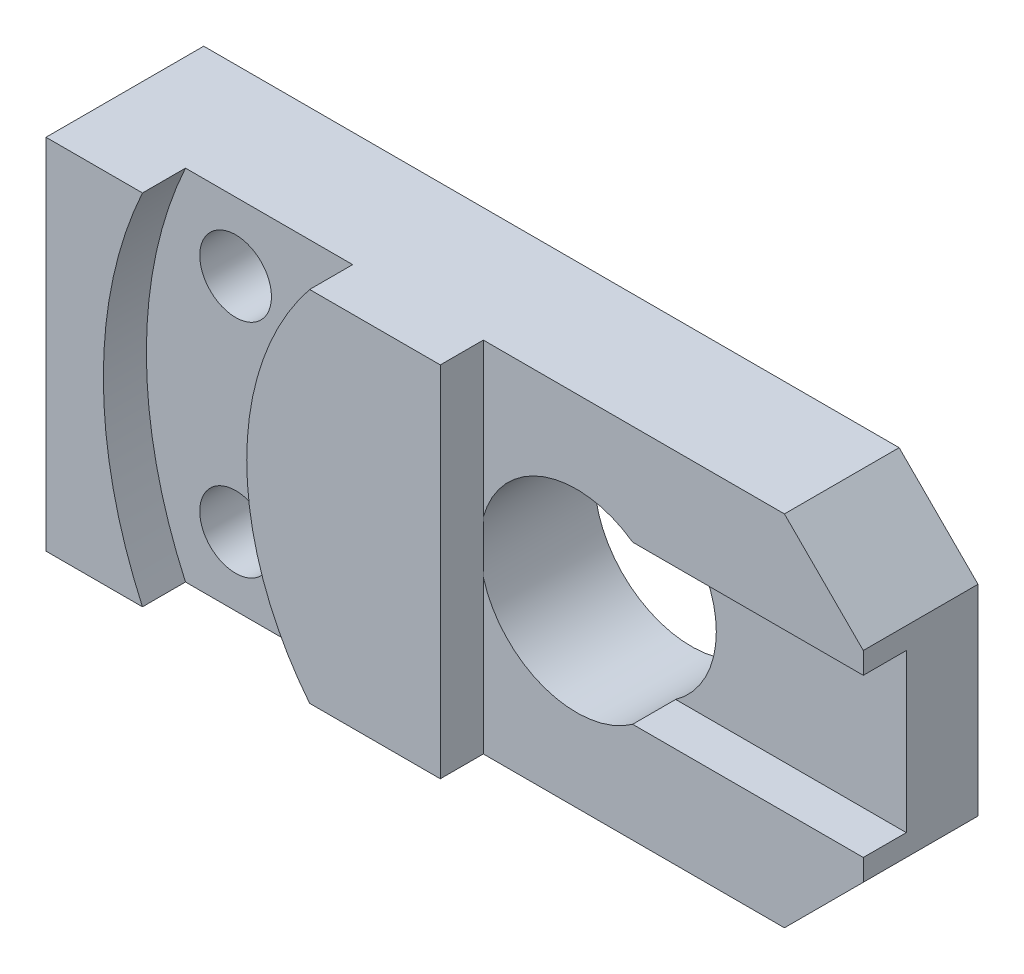
ISO-10303-21;
HEADER;
FILE_DESCRIPTION(('STEP AP214'),'2;1');
FILE_NAME('part.step','',(''),(''),'','','');
FILE_SCHEMA(('AUTOMOTIVE_DESIGN { 1 0 10303 214 1 1 1 1 }'));
ENDSEC;
DATA;
#1=APPLICATION_CONTEXT('core data for automotive mechanical design processes');
#2=APPLICATION_PROTOCOL_DEFINITION('international standard','automotive_design',2000,#1);
#3=PRODUCT_CONTEXT('',#1,'mechanical');
#4=PRODUCT('Part','Part','',(#3));
#5=PRODUCT_RELATED_PRODUCT_CATEGORY('part','',(#4));
#6=PRODUCT_DEFINITION_FORMATION('','',#4);
#7=PRODUCT_DEFINITION_CONTEXT('part definition',#1,'design');
#8=PRODUCT_DEFINITION('design','',#6,#7);
#9=PRODUCT_DEFINITION_SHAPE('','',#8);
#10=(LENGTH_UNIT() NAMED_UNIT(*) SI_UNIT(.MILLI.,.METRE.));
#11=(NAMED_UNIT(*) PLANE_ANGLE_UNIT() SI_UNIT($,.RADIAN.));
#12=(NAMED_UNIT(*) SI_UNIT($,.STERADIAN.) SOLID_ANGLE_UNIT());
#13=UNCERTAINTY_MEASURE_WITH_UNIT(LENGTH_MEASURE(1.E-05),#10,'distance_accuracy_value','');
#14=(GEOMETRIC_REPRESENTATION_CONTEXT(3) GLOBAL_UNCERTAINTY_ASSIGNED_CONTEXT((#13)) GLOBAL_UNIT_ASSIGNED_CONTEXT((#10,
#11,#12)) REPRESENTATION_CONTEXT('',''));
#15=CARTESIAN_POINT('',(0.,0.,0.));
#16=DIRECTION('',(0.,0.,1.));
#17=DIRECTION('',(1.,0.,0.));
#18=AXIS2_PLACEMENT_3D('',#15,#16,#17);
#19=CARTESIAN_POINT('',(0.,0.,16.));
#20=DIRECTION('',(0.,0.,-1.));
#21=DIRECTION('',(-1.,0.,0.));
#22=AXIS2_PLACEMENT_3D('',#19,#20,#21);
#23=PLANE('',#22);
#24=DIRECTION('',(1.,0.,0.));
#25=VECTOR('',#24,1.);
#26=CARTESIAN_POINT('',(54.,-25.,16.));
#27=LINE('',#26,#25);
#28=CARTESIAN_POINT('',(1.00000000000001,-25.,16.));
#29=VERTEX_POINT('',#28);
#30=CARTESIAN_POINT('',(43.,-25.,16.));
#31=VERTEX_POINT('',#30);
#32=EDGE_CURVE('E216',#29,#31,#27,.T.);
#33=ORIENTED_EDGE('',*,*,#32,.T.);
#34=DIRECTION('',(-0.707106781186549,-0.707106781186546,0.));
#35=VECTOR('',#34,1.);
#36=CARTESIAN_POINT('',(54.,-14.,16.));
#37=LINE('',#36,#35);
#38=CARTESIAN_POINT('',(54.,-14.,16.));
#39=VERTEX_POINT('',#38);
#40=EDGE_CURVE('E329',#31,#39,#37,.F.);
#41=ORIENTED_EDGE('',*,*,#40,.T.);
#42=DIRECTION('',(0.,1.,0.));
#43=VECTOR('',#42,1.);
#44=CARTESIAN_POINT('',(54.,25.,16.));
#45=LINE('',#44,#43);
#46=CARTESIAN_POINT('',(54.,-11.,16.));
#47=VERTEX_POINT('',#46);
#48=EDGE_CURVE('E220',#39,#47,#45,.T.);
#49=ORIENTED_EDGE('',*,*,#48,.T.);
#50=DIRECTION('',(1.,0.,0.));
#51=VECTOR('',#50,1.);
#52=CARTESIAN_POINT('',(54.,-11.,16.));
#53=LINE('',#52,#51);
#54=CARTESIAN_POINT('',(21.8262379212493,-11.,16.));
#55=VERTEX_POINT('',#54);
#56=EDGE_CURVE('E183',#55,#47,#53,.T.);
#57=ORIENTED_EDGE('',*,*,#56,.F.);
#58=CARTESIAN_POINT('',(14.,0.,16.));
#59=DIRECTION('',(0.,0.,-1.));
#60=DIRECTION('',(-1.,0.,0.));
#61=AXIS2_PLACEMENT_3D('',#58,#59,#60);
#62=CIRCLE('',#61,13.5);
#63=CARTESIAN_POINT('',(1.,-3.64005494464028,16.));
#64=VERTEX_POINT('',#63);
#65=EDGE_CURVE('E300',#55,#64,#62,.T.);
#66=ORIENTED_EDGE('',*,*,#65,.T.);
#67=DIRECTION('',(0.,-1.,0.));
#68=VECTOR('',#67,1.);
#69=CARTESIAN_POINT('',(1.,25.,16.));
#70=LINE('',#69,#68);
#71=EDGE_CURVE('E210',#64,#29,#70,.T.);
#72=ORIENTED_EDGE('',*,*,#71,.T.);
#73=EDGE_LOOP('',(#33,#41,#49,#57,#66,#72));
#74=FACE_BOUND('',#73,.T.);
#75=ADVANCED_FACE('F41',(#74),#23,.F.);
#76=CARTESIAN_POINT('',(0.,0.,22.));
#77=DIRECTION('',(0.,0.,1.));
#78=DIRECTION('',(1.,0.,0.));
#79=AXIS2_PLACEMENT_3D('',#76,#77,#78);
#80=PLANE('',#79);
#81=DIRECTION('',(0.,-1.,0.));
#82=VECTOR('',#81,1.);
#83=CARTESIAN_POINT('',(1.,25.,22.));
#84=LINE('',#83,#82);
#85=CARTESIAN_POINT('',(1.00000000000001,25.,22.));
#86=VERTEX_POINT('',#85);
#87=CARTESIAN_POINT('',(1.00000000000001,-25.,22.));
#88=VERTEX_POINT('',#87);
#89=EDGE_CURVE('E211',#86,#88,#84,.T.);
#90=ORIENTED_EDGE('',*,*,#89,.F.);
#91=DIRECTION('',(-1.,0.,0.));
#92=VECTOR('',#91,1.);
#93=CARTESIAN_POINT('',(-54.,25.,22.));
#94=LINE('',#93,#92);
#95=CARTESIAN_POINT('',(-17.224989991992,25.,22.));
#96=VERTEX_POINT('',#95);
#97=EDGE_CURVE('E271',#86,#96,#94,.T.);
#98=ORIENTED_EDGE('',*,*,#97,.T.);
#99=CARTESIAN_POINT('',(14.,0.,22.));
#100=DIRECTION('',(0.,0.,-1.));
#101=DIRECTION('',(1.,0.,0.));
#102=AXIS2_PLACEMENT_3D('',#99,#100,#101);
#103=CIRCLE('',#102,40.);
#104=CARTESIAN_POINT('',(-17.224989991992,-25.,22.));
#105=VERTEX_POINT('',#104);
#106=EDGE_CURVE('E206',#105,#96,#103,.T.);
#107=ORIENTED_EDGE('',*,*,#106,.F.);
#108=DIRECTION('',(1.,0.,0.));
#109=VECTOR('',#108,1.);
#110=CARTESIAN_POINT('',(-54.,-25.,22.));
#111=LINE('',#110,#109);
#112=EDGE_CURVE('E276',#105,#88,#111,.T.);
#113=ORIENTED_EDGE('',*,*,#112,.T.);
#114=EDGE_LOOP('',(#90,#98,#107,#113));
#115=FACE_BOUND('',#114,.T.);
#116=ADVANCED_FACE('F370',(#115),#80,.T.);
#117=CARTESIAN_POINT('',(54.,25.,22.));
#118=DIRECTION('',(-1.,0.,0.));
#119=DIRECTION('',(0.,0.,1.));
#120=AXIS2_PLACEMENT_3D('',#117,#118,#119);
#121=PLANE('',#120);
#122=ORIENTED_EDGE('',*,*,#48,.F.);
#123=DIRECTION('',(0.,0.,-1.));
#124=VECTOR('',#123,1.);
#125=CARTESIAN_POINT('',(54.,-14.,22.));
#126=LINE('',#125,#124);
#127=CARTESIAN_POINT('',(54.,-14.,0.));
#128=VERTEX_POINT('',#127);
#129=EDGE_CURVE('E317',#39,#128,#126,.T.);
#130=ORIENTED_EDGE('',*,*,#129,.T.);
#131=DIRECTION('',(0.,1.,0.));
#132=VECTOR('',#131,1.);
#133=CARTESIAN_POINT('',(54.,25.,0.));
#134=LINE('',#133,#132);
#135=CARTESIAN_POINT('',(54.,14.,0.));
#136=VERTEX_POINT('',#135);
#137=EDGE_CURVE('E231',#128,#136,#134,.T.);
#138=ORIENTED_EDGE('',*,*,#137,.T.);
#139=DIRECTION('',(0.,0.,1.));
#140=VECTOR('',#139,1.);
#141=CARTESIAN_POINT('',(54.,14.,22.));
#142=LINE('',#141,#140);
#143=CARTESIAN_POINT('',(54.,14.,16.));
#144=VERTEX_POINT('',#143);
#145=EDGE_CURVE('E314',#136,#144,#142,.T.);
#146=ORIENTED_EDGE('',*,*,#145,.T.);
#147=CARTESIAN_POINT('',(54.,11.,16.));
#148=VERTEX_POINT('',#147);
#149=EDGE_CURVE('E188',#148,#144,#45,.T.);
#150=ORIENTED_EDGE('',*,*,#149,.F.);
#151=DIRECTION('',(0.,0.,1.));
#152=VECTOR('',#151,1.);
#153=CARTESIAN_POINT('',(54.,11.,10.));
#154=LINE('',#153,#152);
#155=CARTESIAN_POINT('',(54.,11.,10.));
#156=VERTEX_POINT('',#155);
#157=EDGE_CURVE('E166',#156,#148,#154,.T.);
#158=ORIENTED_EDGE('',*,*,#157,.F.);
#159=DIRECTION('',(0.,1.,0.));
#160=VECTOR('',#159,1.);
#161=CARTESIAN_POINT('',(54.,11.,10.));
#162=LINE('',#161,#160);
#163=CARTESIAN_POINT('',(54.,-11.,10.));
#164=VERTEX_POINT('',#163);
#165=EDGE_CURVE('E174',#164,#156,#162,.T.);
#166=ORIENTED_EDGE('',*,*,#165,.F.);
#167=DIRECTION('',(0.,0.,1.));
#168=VECTOR('',#167,1.);
#169=CARTESIAN_POINT('',(54.,-11.,10.));
#170=LINE('',#169,#168);
#171=EDGE_CURVE('E190',#164,#47,#170,.T.);
#172=ORIENTED_EDGE('',*,*,#171,.T.);
#173=EDGE_LOOP('',(#122,#130,#138,#146,#150,#158,#166,#172));
#174=FACE_BOUND('',#173,.T.);
#175=ADVANCED_FACE('F187',(#174),#121,.F.);
#176=CARTESIAN_POINT('',(-54.,25.,22.));
#177=DIRECTION('',(0.,-1.,0.));
#178=DIRECTION('',(0.,0.,-1.));
#179=AXIS2_PLACEMENT_3D('',#176,#177,#178);
#180=PLANE('',#179);
#181=DIRECTION('',(-1.,0.,0.));
#182=VECTOR('',#181,1.);
#183=CARTESIAN_POINT('',(1.,25.,16.));
#184=LINE('',#183,#182);
#185=CARTESIAN_POINT('',(43.,25.,16.));
#186=VERTEX_POINT('',#185);
#187=CARTESIAN_POINT('',(1.,25.,16.));
#188=VERTEX_POINT('',#187);
#189=EDGE_CURVE('E207',#186,#188,#184,.T.);
#190=ORIENTED_EDGE('',*,*,#189,.F.);
#191=DIRECTION('',(0.,0.,-1.));
#192=VECTOR('',#191,1.);
#193=CARTESIAN_POINT('',(43.,25.,22.));
#194=LINE('',#193,#192);
#195=CARTESIAN_POINT('',(43.,25.,0.));
#196=VERTEX_POINT('',#195);
#197=EDGE_CURVE('E51',#186,#196,#194,.T.);
#198=ORIENTED_EDGE('',*,*,#197,.T.);
#199=DIRECTION('',(-1.,0.,0.));
#200=VECTOR('',#199,1.);
#201=CARTESIAN_POINT('',(-54.,25.,0.));
#202=LINE('',#201,#200);
#203=CARTESIAN_POINT('',(-54.,25.,0.));
#204=VERTEX_POINT('',#203);
#205=EDGE_CURVE('E285',#196,#204,#202,.T.);
#206=ORIENTED_EDGE('',*,*,#205,.T.);
#207=DIRECTION('',(0.,0.,-1.));
#208=VECTOR('',#207,1.);
#209=CARTESIAN_POINT('',(-54.,25.,22.));
#210=LINE('',#209,#208);
#211=CARTESIAN_POINT('',(-54.,25.,22.));
#212=VERTEX_POINT('',#211);
#213=EDGE_CURVE('E296',#212,#204,#210,.T.);
#214=ORIENTED_EDGE('',*,*,#213,.F.);
#215=CARTESIAN_POINT('',(-40.5435605731786,25.,22.));
#216=VERTEX_POINT('',#215);
#217=EDGE_CURVE('E268',#216,#212,#94,.T.);
#218=ORIENTED_EDGE('',*,*,#217,.F.);
#219=DIRECTION('',(0.,0.,1.));
#220=VECTOR('',#219,1.);
#221=CARTESIAN_POINT('',(-40.5435605731786,25.,16.));
#222=LINE('',#221,#220);
#223=CARTESIAN_POINT('',(-40.5435605731786,25.,16.));
#224=VERTEX_POINT('',#223);
#225=EDGE_CURVE('E262',#224,#216,#222,.T.);
#226=ORIENTED_EDGE('',*,*,#225,.F.);
#227=DIRECTION('',(-1.,0.,0.));
#228=VECTOR('',#227,1.);
#229=CARTESIAN_POINT('',(-17.224989991992,25.,16.));
#230=LINE('',#229,#228);
#231=CARTESIAN_POINT('',(-17.224989991992,25.,16.));
#232=VERTEX_POINT('',#231);
#233=EDGE_CURVE('E238',#232,#224,#230,.T.);
#234=ORIENTED_EDGE('',*,*,#233,.F.);
#235=DIRECTION('',(0.,0.,1.));
#236=VECTOR('',#235,1.);
#237=CARTESIAN_POINT('',(-17.224989991992,25.,16.));
#238=LINE('',#237,#236);
#239=EDGE_CURVE('E251',#232,#96,#238,.T.);
#240=ORIENTED_EDGE('',*,*,#239,.T.);
#241=ORIENTED_EDGE('',*,*,#97,.F.);
#242=DIRECTION('',(0.,0.,1.));
#243=VECTOR('',#242,1.);
#244=CARTESIAN_POINT('',(1.,25.,16.));
#245=LINE('',#244,#243);
#246=EDGE_CURVE('E223',#188,#86,#245,.T.);
#247=ORIENTED_EDGE('',*,*,#246,.F.);
#248=EDGE_LOOP('',(#190,#198,#206,#214,#218,#226,#234,#240,#241,#247));
#249=FACE_BOUND('',#248,.T.);
#250=ADVANCED_FACE('F336',(#249),#180,.F.);
#251=CARTESIAN_POINT('',(-54.,25.,22.));
#252=DIRECTION('',(1.,0.,0.));
#253=DIRECTION('',(0.,0.,-1.));
#254=AXIS2_PLACEMENT_3D('',#251,#252,#253);
#255=PLANE('',#254);
#256=DIRECTION('',(0.,-1.,0.));
#257=VECTOR('',#256,1.);
#258=CARTESIAN_POINT('',(-54.,25.,0.));
#259=LINE('',#258,#257);
#260=CARTESIAN_POINT('',(-54.,-25.,0.));
#261=VERTEX_POINT('',#260);
#262=EDGE_CURVE('E288',#204,#261,#259,.T.);
#263=ORIENTED_EDGE('',*,*,#262,.T.);
#264=DIRECTION('',(0.,0.,-1.));
#265=VECTOR('',#264,1.);
#266=CARTESIAN_POINT('',(-54.,-25.,22.));
#267=LINE('',#266,#265);
#268=CARTESIAN_POINT('',(-54.,-25.,22.));
#269=VERTEX_POINT('',#268);
#270=EDGE_CURVE('E281',#269,#261,#267,.T.);
#271=ORIENTED_EDGE('',*,*,#270,.F.);
#272=DIRECTION('',(0.,-1.,0.));
#273=VECTOR('',#272,1.);
#274=CARTESIAN_POINT('',(-54.,25.,22.));
#275=LINE('',#274,#273);
#276=EDGE_CURVE('E273',#212,#269,#275,.T.);
#277=ORIENTED_EDGE('',*,*,#276,.F.);
#278=ORIENTED_EDGE('',*,*,#213,.T.);
#279=EDGE_LOOP('',(#263,#271,#277,#278));
#280=FACE_BOUND('',#279,.T.);
#281=ADVANCED_FACE('F347',(#280),#255,.F.);
#282=CARTESIAN_POINT('',(-54.,-25.,22.));
#283=DIRECTION('',(0.,1.,0.));
#284=DIRECTION('',(0.,0.,1.));
#285=AXIS2_PLACEMENT_3D('',#282,#283,#284);
#286=PLANE('',#285);
#287=DIRECTION('',(1.,0.,0.));
#288=VECTOR('',#287,1.);
#289=CARTESIAN_POINT('',(-54.,-25.,0.));
#290=LINE('',#289,#288);
#291=CARTESIAN_POINT('',(43.,-25.,0.));
#292=VERTEX_POINT('',#291);
#293=EDGE_CURVE('E272',#261,#292,#290,.T.);
#294=ORIENTED_EDGE('',*,*,#293,.T.);
#295=DIRECTION('',(0.,0.,1.));
#296=VECTOR('',#295,1.);
#297=CARTESIAN_POINT('',(43.,-25.,22.));
#298=LINE('',#297,#296);
#299=EDGE_CURVE('E64',#292,#31,#298,.T.);
#300=ORIENTED_EDGE('',*,*,#299,.T.);
#301=ORIENTED_EDGE('',*,*,#32,.F.);
#302=DIRECTION('',(0.,0.,1.));
#303=VECTOR('',#302,1.);
#304=CARTESIAN_POINT('',(1.00000000000001,-25.,16.));
#305=LINE('',#304,#303);
#306=EDGE_CURVE('E227',#29,#88,#305,.T.);
#307=ORIENTED_EDGE('',*,*,#306,.T.);
#308=ORIENTED_EDGE('',*,*,#112,.F.);
#309=DIRECTION('',(0.,0.,1.));
#310=VECTOR('',#309,1.);
#311=CARTESIAN_POINT('',(-17.224989991992,-25.,16.));
#312=LINE('',#311,#310);
#313=CARTESIAN_POINT('',(-17.224989991992,-25.,16.));
#314=VERTEX_POINT('',#313);
#315=EDGE_CURVE('E226',#314,#105,#312,.T.);
#316=ORIENTED_EDGE('',*,*,#315,.F.);
#317=DIRECTION('',(1.,0.,0.));
#318=VECTOR('',#317,1.);
#319=CARTESIAN_POINT('',(-40.5435605731786,-25.,16.));
#320=LINE('',#319,#318);
#321=CARTESIAN_POINT('',(-40.5435605731786,-25.,16.));
#322=VERTEX_POINT('',#321);
#323=EDGE_CURVE('E247',#322,#314,#320,.T.);
#324=ORIENTED_EDGE('',*,*,#323,.F.);
#325=DIRECTION('',(0.,0.,1.));
#326=VECTOR('',#325,1.);
#327=CARTESIAN_POINT('',(-40.5435605731786,-25.,16.));
#328=LINE('',#327,#326);
#329=CARTESIAN_POINT('',(-40.5435605731786,-25.,22.));
#330=VERTEX_POINT('',#329);
#331=EDGE_CURVE('E258',#322,#330,#328,.T.);
#332=ORIENTED_EDGE('',*,*,#331,.T.);
#333=EDGE_CURVE('E277',#269,#330,#111,.T.);
#334=ORIENTED_EDGE('',*,*,#333,.F.);
#335=ORIENTED_EDGE('',*,*,#270,.T.);
#336=EDGE_LOOP('',(#294,#300,#301,#307,#308,#316,#324,#332,#334,#335));
#337=FACE_BOUND('',#336,.T.);
#338=ADVANCED_FACE('F350',(#337),#286,.F.);
#339=CARTESIAN_POINT('',(14.,0.,22.));
#340=DIRECTION('',(0.,0.,1.));
#341=DIRECTION('',(1.,0.,0.));
#342=AXIS2_PLACEMENT_3D('',#339,#340,#341);
#343=CIRCLE('',#342,60.);
#344=EDGE_CURVE('E239',#216,#330,#343,.T.);
#345=ORIENTED_EDGE('',*,*,#344,.F.);
#346=ORIENTED_EDGE('',*,*,#217,.T.);
#347=ORIENTED_EDGE('',*,*,#276,.T.);
#348=ORIENTED_EDGE('',*,*,#333,.T.);
#349=EDGE_LOOP('',(#345,#346,#347,#348));
#350=FACE_BOUND('',#349,.T.);
#351=ADVANCED_FACE('F354',(#350),#80,.T.);
#352=CARTESIAN_POINT('',(0.,0.,0.));
#353=DIRECTION('',(0.,0.,1.));
#354=DIRECTION('',(1.,0.,0.));
#355=AXIS2_PLACEMENT_3D('',#352,#353,#354);
#356=PLANE('',#355);
#357=CARTESIAN_POINT('',(-33.5531018967217,15.45,0.));
#358=DIRECTION('',(0.,0.,1.));
#359=DIRECTION('',(1.,0.,0.));
#360=AXIS2_PLACEMENT_3D('',#357,#358,#359);
#361=CIRCLE('',#360,5.);
#362=CARTESIAN_POINT('',(-28.5531018967217,15.45,0.));
#363=VERTEX_POINT('',#362);
#364=EDGE_CURVE('E451',#363,#363,#361,.F.);
#365=ORIENTED_EDGE('',*,*,#364,.F.);
#366=EDGE_LOOP('',(#365));
#367=FACE_BOUND('',#366,.T.);
#368=CARTESIAN_POINT('',(-33.5531018967217,-15.45,0.));
#369=DIRECTION('',(0.,0.,1.));
#370=DIRECTION('',(1.,0.,0.));
#371=AXIS2_PLACEMENT_3D('',#368,#369,#370);
#372=CIRCLE('',#371,5.);
#373=CARTESIAN_POINT('',(-28.5531018967217,-15.45,0.));
#374=VERTEX_POINT('',#373);
#375=EDGE_CURVE('E454',#374,#374,#372,.F.);
#376=ORIENTED_EDGE('',*,*,#375,.F.);
#377=EDGE_LOOP('',(#376));
#378=FACE_BOUND('',#377,.T.);
#379=CARTESIAN_POINT('',(14.,0.,0.));
#380=DIRECTION('',(0.,0.,1.));
#381=DIRECTION('',(1.,0.,0.));
#382=AXIS2_PLACEMENT_3D('',#379,#380,#381);
#383=CIRCLE('',#382,13.5);
#384=CARTESIAN_POINT('',(27.5,0.,0.));
#385=VERTEX_POINT('',#384);
#386=EDGE_CURVE('E202',#385,#385,#383,.F.);
#387=ORIENTED_EDGE('',*,*,#386,.F.);
#388=EDGE_LOOP('',(#387));
#389=FACE_BOUND('',#388,.T.);
#390=ORIENTED_EDGE('',*,*,#137,.F.);
#391=DIRECTION('',(0.707106781186549,0.707106781186546,0.));
#392=VECTOR('',#391,1.);
#393=CARTESIAN_POINT('',(54.,-14.,0.));
#394=LINE('',#393,#392);
#395=EDGE_CURVE('E324',#128,#292,#394,.F.);
#396=ORIENTED_EDGE('',*,*,#395,.T.);
#397=ORIENTED_EDGE('',*,*,#293,.F.);
#398=ORIENTED_EDGE('',*,*,#262,.F.);
#399=ORIENTED_EDGE('',*,*,#205,.F.);
#400=DIRECTION('',(-0.707106781186546,0.707106781186549,0.));
#401=VECTOR('',#400,1.);
#402=CARTESIAN_POINT('',(43.,25.,0.));
#403=LINE('',#402,#401);
#404=EDGE_CURVE('E321',#196,#136,#403,.F.);
#405=ORIENTED_EDGE('',*,*,#404,.T.);
#406=EDGE_LOOP('',(#390,#396,#397,#398,#399,#405));
#407=FACE_BOUND('',#406,.T.);
#408=ADVANCED_FACE('F343',(#367,#378,#389,#407),#356,.F.);
#409=CARTESIAN_POINT('',(14.,0.,16.));
#410=DIRECTION('',(0.,0.,1.));
#411=DIRECTION('',(1.,0.,0.));
#412=AXIS2_PLACEMENT_3D('',#409,#410,#411);
#413=CYLINDRICAL_SURFACE('',#412,40.);
#414=ORIENTED_EDGE('',*,*,#106,.T.);
#415=ORIENTED_EDGE('',*,*,#239,.F.);
#416=CARTESIAN_POINT('',(14.,0.,16.));
#417=DIRECTION('',(0.,0.,-1.));
#418=DIRECTION('',(1.,0.,0.));
#419=AXIS2_PLACEMENT_3D('',#416,#417,#418);
#420=CIRCLE('',#419,40.);
#421=EDGE_CURVE('E234',#314,#232,#420,.T.);
#422=ORIENTED_EDGE('',*,*,#421,.F.);
#423=ORIENTED_EDGE('',*,*,#315,.T.);
#424=EDGE_LOOP('',(#414,#415,#422,#423));
#425=FACE_BOUND('',#424,.T.);
#426=ADVANCED_FACE('F364',(#425),#413,.T.);
#427=CARTESIAN_POINT('',(14.,0.,16.));
#428=DIRECTION('',(0.,0.,1.));
#429=DIRECTION('',(1.,0.,0.));
#430=AXIS2_PLACEMENT_3D('',#427,#428,#429);
#431=CYLINDRICAL_SURFACE('',#430,60.);
#432=ORIENTED_EDGE('',*,*,#344,.T.);
#433=ORIENTED_EDGE('',*,*,#331,.F.);
#434=CARTESIAN_POINT('',(14.,0.,16.));
#435=DIRECTION('',(0.,0.,1.));
#436=DIRECTION('',(1.,0.,0.));
#437=AXIS2_PLACEMENT_3D('',#434,#435,#436);
#438=CIRCLE('',#437,60.);
#439=EDGE_CURVE('E243',#224,#322,#438,.T.);
#440=ORIENTED_EDGE('',*,*,#439,.F.);
#441=ORIENTED_EDGE('',*,*,#225,.T.);
#442=EDGE_LOOP('',(#432,#433,#440,#441));
#443=FACE_BOUND('',#442,.T.);
#444=ADVANCED_FACE('F359',(#443),#431,.F.);
#445=CARTESIAN_POINT('',(14.,0.,16.));
#446=DIRECTION('',(0.,0.,1.));
#447=DIRECTION('',(1.,0.,0.));
#448=AXIS2_PLACEMENT_3D('',#445,#446,#447);
#449=PLANE('',#448);
#450=CARTESIAN_POINT('',(-33.5531018967217,15.45,16.));
#451=DIRECTION('',(0.,0.,1.));
#452=DIRECTION('',(1.,0.,0.));
#453=AXIS2_PLACEMENT_3D('',#450,#451,#452);
#454=CIRCLE('',#453,5.);
#455=CARTESIAN_POINT('',(-28.5531018967217,15.45,16.));
#456=VERTEX_POINT('',#455);
#457=EDGE_CURVE('E458',#456,#456,#454,.T.);
#458=ORIENTED_EDGE('',*,*,#457,.F.);
#459=EDGE_LOOP('',(#458));
#460=FACE_BOUND('',#459,.T.);
#461=CARTESIAN_POINT('',(-33.5531018967217,-15.45,16.));
#462=DIRECTION('',(0.,0.,1.));
#463=DIRECTION('',(-1.,0.,0.));
#464=AXIS2_PLACEMENT_3D('',#461,#462,#463);
#465=CIRCLE('',#464,5.);
#466=CARTESIAN_POINT('',(-38.5531018967217,-15.45,16.));
#467=VERTEX_POINT('',#466);
#468=EDGE_CURVE('E459',#467,#467,#465,.T.);
#469=ORIENTED_EDGE('',*,*,#468,.F.);
#470=EDGE_LOOP('',(#469));
#471=FACE_BOUND('',#470,.T.);
#472=ORIENTED_EDGE('',*,*,#421,.T.);
#473=ORIENTED_EDGE('',*,*,#233,.T.);
#474=ORIENTED_EDGE('',*,*,#439,.T.);
#475=ORIENTED_EDGE('',*,*,#323,.T.);
#476=EDGE_LOOP('',(#472,#473,#474,#475));
#477=FACE_BOUND('',#476,.T.);
#478=ADVANCED_FACE('F361',(#460,#471,#477),#449,.T.);
#479=CARTESIAN_POINT('',(1.,25.,16.));
#480=DIRECTION('',(-1.,0.,0.));
#481=DIRECTION('',(0.,-1.,0.));
#482=AXIS2_PLACEMENT_3D('',#479,#480,#481);
#483=PLANE('',#482);
#484=ORIENTED_EDGE('',*,*,#89,.T.);
#485=ORIENTED_EDGE('',*,*,#306,.F.);
#486=ORIENTED_EDGE('',*,*,#71,.F.);
#487=CARTESIAN_POINT('',(1.,3.64005494464028,16.));
#488=VERTEX_POINT('',#487);
#489=EDGE_CURVE('E217',#488,#64,#70,.T.);
#490=ORIENTED_EDGE('',*,*,#489,.F.);
#491=EDGE_CURVE('E212',#188,#488,#70,.T.);
#492=ORIENTED_EDGE('',*,*,#491,.F.);
#493=ORIENTED_EDGE('',*,*,#246,.T.);
#494=EDGE_LOOP('',(#484,#485,#486,#490,#492,#493));
#495=FACE_BOUND('',#494,.T.);
#496=ADVANCED_FACE('F387',(#495),#483,.F.);
#497=ORIENTED_EDGE('',*,*,#149,.T.);
#498=DIRECTION('',(0.707106781186546,-0.707106781186549,0.));
#499=VECTOR('',#498,1.);
#500=CARTESIAN_POINT('',(43.,25.,16.));
#501=LINE('',#500,#499);
#502=EDGE_CURVE('E11',#144,#186,#501,.F.);
#503=ORIENTED_EDGE('',*,*,#502,.T.);
#504=ORIENTED_EDGE('',*,*,#189,.T.);
#505=ORIENTED_EDGE('',*,*,#491,.T.);
#506=CARTESIAN_POINT('',(21.8262379212493,11.,16.));
#507=VERTEX_POINT('',#506);
#508=EDGE_CURVE('E301',#488,#507,#62,.T.);
#509=ORIENTED_EDGE('',*,*,#508,.T.);
#510=DIRECTION('',(-1.,0.,0.));
#511=VECTOR('',#510,1.);
#512=CARTESIAN_POINT('',(54.,11.,16.));
#513=LINE('',#512,#511);
#514=EDGE_CURVE('E391',#148,#507,#513,.T.);
#515=ORIENTED_EDGE('',*,*,#514,.F.);
#516=EDGE_LOOP('',(#497,#503,#504,#505,#509,#515));
#517=FACE_BOUND('',#516,.T.);
#518=ADVANCED_FACE('F390',(#517),#23,.F.);
#519=CARTESIAN_POINT('',(14.,0.,16.));
#520=DIRECTION('',(0.,0.,1.));
#521=DIRECTION('',(1.,0.,0.));
#522=AXIS2_PLACEMENT_3D('',#519,#520,#521);
#523=PLANE('',#522);
#524=CARTESIAN_POINT('',(14.,0.,16.));
#525=DIRECTION('',(0.,0.,1.));
#526=DIRECTION('',(1.,0.,0.));
#527=AXIS2_PLACEMENT_3D('',#524,#525,#526);
#528=CIRCLE('',#527,13.5);
#529=EDGE_CURVE('E194',#488,#64,#528,.T.);
#530=ORIENTED_EDGE('',*,*,#529,.F.);
#531=ORIENTED_EDGE('',*,*,#489,.T.);
#532=EDGE_LOOP('',(#530,#531));
#533=FACE_BOUND('',#532,.T.);
#534=ADVANCED_FACE('F397',(#533),#523,.F.);
#535=CARTESIAN_POINT('',(14.,0.,-0.001000000000001));
#536=DIRECTION('',(0.,0.,1.));
#537=DIRECTION('',(1.,0.,0.));
#538=AXIS2_PLACEMENT_3D('',#535,#536,#537);
#539=CYLINDRICAL_SURFACE('',#538,13.5);
#540=ORIENTED_EDGE('',*,*,#65,.F.);
#541=DIRECTION('',(0.,0.,1.));
#542=VECTOR('',#541,1.);
#543=CARTESIAN_POINT('',(21.8262379212493,-11.,-0.001000000000001));
#544=LINE('',#543,#542);
#545=CARTESIAN_POINT('',(21.8262379212493,-11.,10.));
#546=VERTEX_POINT('',#545);
#547=EDGE_CURVE('E310',#55,#546,#544,.F.);
#548=ORIENTED_EDGE('',*,*,#547,.T.);
#549=CARTESIAN_POINT('',(14.,0.,10.));
#550=DIRECTION('',(0.,0.,-1.));
#551=DIRECTION('',(-1.,0.,0.));
#552=AXIS2_PLACEMENT_3D('',#549,#550,#551);
#553=CIRCLE('',#552,13.5);
#554=CARTESIAN_POINT('',(21.8262379212493,11.,10.));
#555=VERTEX_POINT('',#554);
#556=EDGE_CURVE('E305',#546,#555,#553,.F.);
#557=ORIENTED_EDGE('',*,*,#556,.T.);
#558=DIRECTION('',(0.,0.,1.));
#559=VECTOR('',#558,1.);
#560=CARTESIAN_POINT('',(21.8262379212493,11.,-0.001000000000001));
#561=LINE('',#560,#559);
#562=EDGE_CURVE('E169',#555,#507,#561,.T.);
#563=ORIENTED_EDGE('',*,*,#562,.T.);
#564=ORIENTED_EDGE('',*,*,#508,.F.);
#565=ORIENTED_EDGE('',*,*,#529,.T.);
#566=EDGE_LOOP('',(#540,#548,#557,#563,#564,#565));
#567=FACE_BOUND('',#566,.T.);
#568=ORIENTED_EDGE('',*,*,#386,.T.);
#569=EDGE_LOOP('',(#568));
#570=FACE_BOUND('',#569,.T.);
#571=ADVANCED_FACE('F394',(#567,#570),#539,.F.);
#572=CARTESIAN_POINT('',(54.,-11.,10.));
#573=DIRECTION('',(0.,-1.,0.));
#574=DIRECTION('',(0.,0.,-1.));
#575=AXIS2_PLACEMENT_3D('',#572,#573,#574);
#576=PLANE('',#575);
#577=ORIENTED_EDGE('',*,*,#56,.T.);
#578=ORIENTED_EDGE('',*,*,#171,.F.);
#579=DIRECTION('',(1.,0.,0.));
#580=VECTOR('',#579,1.);
#581=CARTESIAN_POINT('',(54.,-11.,10.));
#582=LINE('',#581,#580);
#583=EDGE_CURVE('E173',#546,#164,#582,.T.);
#584=ORIENTED_EDGE('',*,*,#583,.F.);
#585=ORIENTED_EDGE('',*,*,#547,.F.);
#586=EDGE_LOOP('',(#577,#578,#584,#585));
#587=FACE_BOUND('',#586,.T.);
#588=ADVANCED_FACE('F404',(#587),#576,.F.);
#589=CARTESIAN_POINT('',(54.,11.,10.));
#590=DIRECTION('',(0.,1.,0.));
#591=DIRECTION('',(0.,0.,1.));
#592=AXIS2_PLACEMENT_3D('',#589,#590,#591);
#593=PLANE('',#592);
#594=DIRECTION('',(-1.,0.,0.));
#595=VECTOR('',#594,1.);
#596=CARTESIAN_POINT('',(54.,11.,10.));
#597=LINE('',#596,#595);
#598=EDGE_CURVE('E162',#156,#555,#597,.T.);
#599=ORIENTED_EDGE('',*,*,#598,.F.);
#600=ORIENTED_EDGE('',*,*,#157,.T.);
#601=ORIENTED_EDGE('',*,*,#514,.T.);
#602=ORIENTED_EDGE('',*,*,#562,.F.);
#603=EDGE_LOOP('',(#599,#600,#601,#602));
#604=FACE_BOUND('',#603,.T.);
#605=ADVANCED_FACE('F164',(#604),#593,.F.);
#606=CARTESIAN_POINT('',(0.,0.,10.));
#607=DIRECTION('',(0.,0.,-1.));
#608=DIRECTION('',(-1.,0.,0.));
#609=AXIS2_PLACEMENT_3D('',#606,#607,#608);
#610=PLANE('',#609);
#611=ORIENTED_EDGE('',*,*,#583,.T.);
#612=ORIENTED_EDGE('',*,*,#165,.T.);
#613=ORIENTED_EDGE('',*,*,#598,.T.);
#614=ORIENTED_EDGE('',*,*,#556,.F.);
#615=EDGE_LOOP('',(#611,#612,#613,#614));
#616=FACE_BOUND('',#615,.T.);
#617=ADVANCED_FACE('F177',(#616),#610,.F.);
#618=CARTESIAN_POINT('',(54.,-14.,22.));
#619=DIRECTION('',(-0.707106781186546,0.707106781186549,0.));
#620=DIRECTION('',(0.,0.,-1.));
#621=AXIS2_PLACEMENT_3D('',#618,#619,#620);
#622=PLANE('',#621);
#623=ORIENTED_EDGE('',*,*,#40,.F.);
#624=ORIENTED_EDGE('',*,*,#299,.F.);
#625=ORIENTED_EDGE('',*,*,#395,.F.);
#626=ORIENTED_EDGE('',*,*,#129,.F.);
#627=EDGE_LOOP('',(#623,#624,#625,#626));
#628=FACE_BOUND('',#627,.T.);
#629=ADVANCED_FACE('F435',(#628),#622,.F.);
#630=CARTESIAN_POINT('',(43.,25.,22.));
#631=DIRECTION('',(-0.707106781186549,-0.707106781186546,0.));
#632=DIRECTION('',(0.,0.,-1.));
#633=AXIS2_PLACEMENT_3D('',#630,#631,#632);
#634=PLANE('',#633);
#635=ORIENTED_EDGE('',*,*,#502,.F.);
#636=ORIENTED_EDGE('',*,*,#145,.F.);
#637=ORIENTED_EDGE('',*,*,#404,.F.);
#638=ORIENTED_EDGE('',*,*,#197,.F.);
#639=EDGE_LOOP('',(#635,#636,#637,#638));
#640=FACE_BOUND('',#639,.T.);
#641=ADVANCED_FACE('F44',(#640),#634,.F.);
#642=CARTESIAN_POINT('',(-33.5531018967217,-15.45,-0.001000000000001));
#643=DIRECTION('',(0.,0.,1.));
#644=DIRECTION('',(1.,0.,0.));
#645=AXIS2_PLACEMENT_3D('',#642,#643,#644);
#646=CYLINDRICAL_SURFACE('',#645,5.);
#647=ORIENTED_EDGE('',*,*,#468,.T.);
#648=EDGE_LOOP('',(#647));
#649=FACE_BOUND('',#648,.T.);
#650=ORIENTED_EDGE('',*,*,#375,.T.);
#651=EDGE_LOOP('',(#650));
#652=FACE_BOUND('',#651,.T.);
#653=ADVANCED_FACE('F444',(#649,#652),#646,.F.);
#654=CARTESIAN_POINT('',(-33.5531018967217,15.45,-0.001000000000001));
#655=DIRECTION('',(0.,0.,1.));
#656=DIRECTION('',(1.,0.,0.));
#657=AXIS2_PLACEMENT_3D('',#654,#655,#656);
#658=CYLINDRICAL_SURFACE('',#657,5.);
#659=ORIENTED_EDGE('',*,*,#457,.T.);
#660=EDGE_LOOP('',(#659));
#661=FACE_BOUND('',#660,.T.);
#662=ORIENTED_EDGE('',*,*,#364,.T.);
#663=EDGE_LOOP('',(#662));
#664=FACE_BOUND('',#663,.T.);
#665=ADVANCED_FACE('F470',(#661,#664),#658,.F.);
#666=CLOSED_SHELL('',(#75,#116,#175,#250,#281,#338,#351,#408,#426,#444,#478,#496,#518,#534,#571,
#588,#605,#617,#629,#641,#653,#665));
#667=MANIFOLD_SOLID_BREP('B2',#666);
#668=ADVANCED_BREP_SHAPE_REPRESENTATION('',(#18,#667),#14);
#669=SHAPE_DEFINITION_REPRESENTATION(#9,#668);
ENDSEC;
END-ISO-10303-21;
